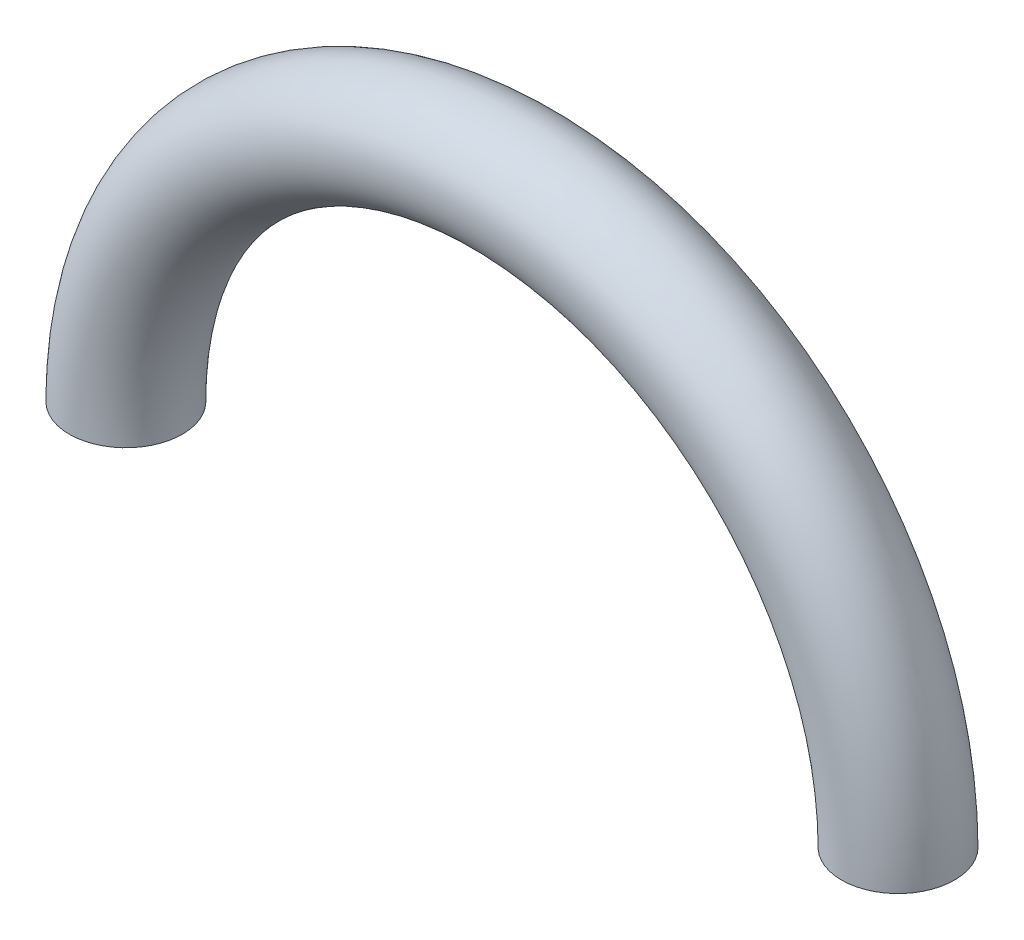
ISO-10303-21;
HEADER;
FILE_DESCRIPTION(('STEP AP214'),'2;1');
FILE_NAME('part.step','',(''),(''),'','','');
FILE_SCHEMA(('AUTOMOTIVE_DESIGN { 1 0 10303 214 1 1 1 1 }'));
ENDSEC;
DATA;
#1=APPLICATION_CONTEXT('core data for automotive mechanical design processes');
#2=APPLICATION_PROTOCOL_DEFINITION('international standard','automotive_design',2000,#1);
#3=PRODUCT_CONTEXT('',#1,'mechanical');
#4=PRODUCT('Part','Part','',(#3));
#5=PRODUCT_RELATED_PRODUCT_CATEGORY('part','',(#4));
#6=PRODUCT_DEFINITION_FORMATION('','',#4);
#7=PRODUCT_DEFINITION_CONTEXT('part definition',#1,'design');
#8=PRODUCT_DEFINITION('design','',#6,#7);
#9=PRODUCT_DEFINITION_SHAPE('','',#8);
#10=(LENGTH_UNIT() NAMED_UNIT(*) SI_UNIT(.MILLI.,.METRE.));
#11=(NAMED_UNIT(*) PLANE_ANGLE_UNIT() SI_UNIT($,.RADIAN.));
#12=(NAMED_UNIT(*) SI_UNIT($,.STERADIAN.) SOLID_ANGLE_UNIT());
#13=UNCERTAINTY_MEASURE_WITH_UNIT(LENGTH_MEASURE(1.E-05),#10,'distance_accuracy_value','');
#14=(GEOMETRIC_REPRESENTATION_CONTEXT(3) GLOBAL_UNCERTAINTY_ASSIGNED_CONTEXT((#13)) GLOBAL_UNIT_ASSIGNED_CONTEXT((#10,
#11,#12)) REPRESENTATION_CONTEXT('',''));
#15=CARTESIAN_POINT('',(0.,0.,0.));
#16=DIRECTION('',(0.,0.,1.));
#17=DIRECTION('',(1.,0.,0.));
#18=AXIS2_PLACEMENT_3D('',#15,#16,#17);
#19=CARTESIAN_POINT('',(12.4999358752011,0.,0.));
#20=DIRECTION('',(0.,1.,0.));
#21=DIRECTION('',(0.,0.,1.));
#22=AXIS2_PLACEMENT_3D('',#19,#20,#21);
#23=PLANE('',#22);
#24=CARTESIAN_POINT('',(12.4999358752011,0.,0.));
#25=DIRECTION('',(0.,1.,0.));
#26=DIRECTION('',(0.,0.,1.));
#27=AXIS2_PLACEMENT_3D('',#24,#25,#26);
#28=CIRCLE('',#27,1.83045085969461);
#29=CARTESIAN_POINT('',(12.4999358752011,0.,1.83045085969461));
#30=VERTEX_POINT('',#29);
#31=EDGE_CURVE('E39',#30,#30,#28,.T.);
#32=ORIENTED_EDGE('',*,*,#31,.F.);
#33=EDGE_LOOP('',(#32));
#34=FACE_BOUND('',#33,.T.);
#35=ADVANCED_FACE('F32',(#34),#23,.F.);
#36=CARTESIAN_POINT('',(-12.4999358752011,0.,0.));
#37=DIRECTION('',(0.,-1.,0.));
#38=DIRECTION('',(0.,0.,1.));
#39=AXIS2_PLACEMENT_3D('',#36,#37,#38);
#40=PLANE('',#39);
#41=CARTESIAN_POINT('',(-12.4999358752011,0.,0.));
#42=DIRECTION('',(0.,-1.,0.));
#43=DIRECTION('',(0.,0.,1.));
#44=AXIS2_PLACEMENT_3D('',#41,#42,#43);
#45=CIRCLE('',#44,1.83045085969461);
#46=CARTESIAN_POINT('',(-12.4999358752011,0.,1.83045085969461));
#47=VERTEX_POINT('',#46);
#48=EDGE_CURVE('E11',#47,#47,#45,.T.);
#49=ORIENTED_EDGE('',*,*,#48,.T.);
#50=EDGE_LOOP('',(#49));
#51=FACE_BOUND('',#50,.T.);
#52=ADVANCED_FACE('F46',(#51),#40,.T.);
#53=CARTESIAN_POINT('',(0.,0.,0.));
#54=DIRECTION('',(0.,0.,1.));
#55=DIRECTION('',(1.,0.,0.));
#56=AXIS2_PLACEMENT_3D('',#53,#54,#55);
#57=TOROIDAL_SURFACE('',#56,12.4999358752011,1.83045085969461);
#58=ORIENTED_EDGE('',*,*,#48,.F.);
#59=EDGE_LOOP('',(#58));
#60=FACE_BOUND('',#59,.T.);
#61=ORIENTED_EDGE('',*,*,#31,.T.);
#62=EDGE_LOOP('',(#61));
#63=FACE_BOUND('',#62,.T.);
#64=ADVANCED_FACE('F48',(#60,#63),#57,.T.);
#65=CLOSED_SHELL('',(#35,#52,#64));
#66=MANIFOLD_SOLID_BREP('B2',#65);
#67=ADVANCED_BREP_SHAPE_REPRESENTATION('',(#18,#66),#14);
#68=SHAPE_DEFINITION_REPRESENTATION(#9,#67);
ENDSEC;
END-ISO-10303-21;
